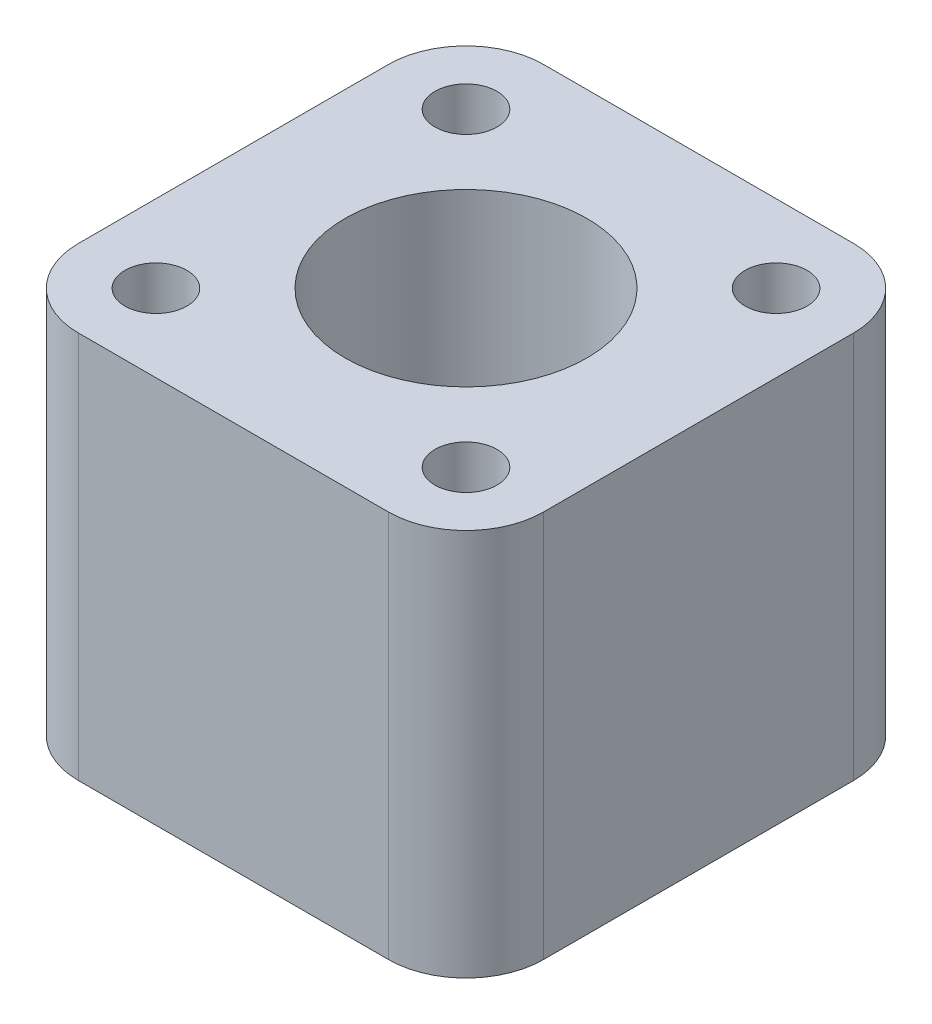
ISO-10303-21;
HEADER;
FILE_DESCRIPTION(('STEP AP214'),'2;1');
FILE_NAME('part.step','',(''),(''),'','','');
FILE_SCHEMA(('AUTOMOTIVE_DESIGN { 1 0 10303 214 1 1 1 1 }'));
ENDSEC;
DATA;
#1=APPLICATION_CONTEXT('core data for automotive mechanical design processes');
#2=APPLICATION_PROTOCOL_DEFINITION('international standard','automotive_design',2000,#1);
#3=PRODUCT_CONTEXT('',#1,'mechanical');
#4=PRODUCT('Part','Part','',(#3));
#5=PRODUCT_RELATED_PRODUCT_CATEGORY('part','',(#4));
#6=PRODUCT_DEFINITION_FORMATION('','',#4);
#7=PRODUCT_DEFINITION_CONTEXT('part definition',#1,'design');
#8=PRODUCT_DEFINITION('design','',#6,#7);
#9=PRODUCT_DEFINITION_SHAPE('','',#8);
#10=(LENGTH_UNIT() NAMED_UNIT(*) SI_UNIT(.MILLI.,.METRE.));
#11=(NAMED_UNIT(*) PLANE_ANGLE_UNIT() SI_UNIT($,.RADIAN.));
#12=(NAMED_UNIT(*) SI_UNIT($,.STERADIAN.) SOLID_ANGLE_UNIT());
#13=UNCERTAINTY_MEASURE_WITH_UNIT(LENGTH_MEASURE(1.E-05),#10,'distance_accuracy_value','');
#14=(GEOMETRIC_REPRESENTATION_CONTEXT(3) GLOBAL_UNCERTAINTY_ASSIGNED_CONTEXT((#13)) GLOBAL_UNIT_ASSIGNED_CONTEXT((#10,
#11,#12)) REPRESENTATION_CONTEXT('',''));
#15=CARTESIAN_POINT('',(0.,0.,0.));
#16=DIRECTION('',(0.,0.,1.));
#17=DIRECTION('',(1.,0.,0.));
#18=AXIS2_PLACEMENT_3D('',#15,#16,#17);
#19=CARTESIAN_POINT('',(0.,15.875,0.));
#20=DIRECTION('',(0.,-1.,0.));
#21=DIRECTION('',(0.,0.,-1.));
#22=AXIS2_PLACEMENT_3D('',#19,#20,#21);
#23=CYLINDRICAL_SURFACE('',#22,3.96875);
#24=CARTESIAN_POINT('',(0.,0.,0.));
#25=DIRECTION('',(0.,1.,0.));
#26=DIRECTION('',(0.,0.,1.));
#27=AXIS2_PLACEMENT_3D('',#24,#25,#26);
#28=CIRCLE('',#27,3.96875);
#29=CARTESIAN_POINT('',(0.,0.,3.96875));
#30=VERTEX_POINT('',#29);
#31=EDGE_CURVE('E205',#30,#30,#28,.T.);
#32=ORIENTED_EDGE('',*,*,#31,.F.);
#33=EDGE_LOOP('',(#32));
#34=FACE_BOUND('',#33,.T.);
#35=CARTESIAN_POINT('',(0.,6.35,0.));
#36=DIRECTION('',(0.,1.,0.));
#37=DIRECTION('',(0.,0.,1.));
#38=AXIS2_PLACEMENT_3D('',#35,#36,#37);
#39=CIRCLE('',#38,3.96875);
#40=CARTESIAN_POINT('',(0.,6.35,3.96875));
#41=VERTEX_POINT('',#40);
#42=EDGE_CURVE('E37',#41,#41,#39,.T.);
#43=ORIENTED_EDGE('',*,*,#42,.T.);
#44=EDGE_LOOP('',(#43));
#45=FACE_BOUND('',#44,.T.);
#46=ADVANCED_FACE('F33',(#34,#45),#23,.F.);
#47=CARTESIAN_POINT('',(0.,15.875,0.));
#48=DIRECTION('',(0.,-1.,0.));
#49=DIRECTION('',(0.,0.,-1.));
#50=AXIS2_PLACEMENT_3D('',#47,#48,#49);
#51=PLANE('',#50);
#52=CARTESIAN_POINT('',(0.,15.875,0.));
#53=DIRECTION('',(0.,1.,0.));
#54=DIRECTION('',(0.,0.,1.));
#55=AXIS2_PLACEMENT_3D('',#52,#53,#54);
#56=CIRCLE('',#55,4.953);
#57=CARTESIAN_POINT('',(0.,15.875,4.953));
#58=VERTEX_POINT('',#57);
#59=EDGE_CURVE('E261',#58,#58,#56,.T.);
#60=ORIENTED_EDGE('',*,*,#59,.F.);
#61=EDGE_LOOP('',(#60));
#62=FACE_BOUND('',#61,.T.);
#63=DIRECTION('',(0.,0.,-1.));
#64=VECTOR('',#63,1.);
#65=CARTESIAN_POINT('',(9.525,15.875,9.525));
#66=LINE('',#65,#64);
#67=CARTESIAN_POINT('',(9.525,15.875,6.35));
#68=VERTEX_POINT('',#67);
#69=CARTESIAN_POINT('',(9.525,15.875,-6.35));
#70=VERTEX_POINT('',#69);
#71=EDGE_CURVE('E137',#68,#70,#66,.T.);
#72=ORIENTED_EDGE('',*,*,#71,.T.);
#73=CARTESIAN_POINT('',(6.35,15.875,-6.35));
#74=DIRECTION('',(0.,-1.,0.));
#75=DIRECTION('',(0.,0.,-1.));
#76=AXIS2_PLACEMENT_3D('',#73,#74,#75);
#77=CIRCLE('',#76,3.175);
#78=CARTESIAN_POINT('',(6.34999999999999,15.875,-9.525));
#79=VERTEX_POINT('',#78);
#80=EDGE_CURVE('E152',#70,#79,#77,.F.);
#81=ORIENTED_EDGE('',*,*,#80,.T.);
#82=DIRECTION('',(-1.,0.,0.));
#83=VECTOR('',#82,1.);
#84=CARTESIAN_POINT('',(-9.525,15.875,-9.525));
#85=LINE('',#84,#83);
#86=CARTESIAN_POINT('',(-6.35,15.875,-9.525));
#87=VERTEX_POINT('',#86);
#88=EDGE_CURVE('E119',#79,#87,#85,.T.);
#89=ORIENTED_EDGE('',*,*,#88,.T.);
#90=CARTESIAN_POINT('',(-6.35,15.875,-6.35));
#91=DIRECTION('',(0.,-1.,0.));
#92=DIRECTION('',(0.,0.,-1.));
#93=AXIS2_PLACEMENT_3D('',#90,#91,#92);
#94=CIRCLE('',#93,3.175);
#95=CARTESIAN_POINT('',(-9.525,15.875,-6.34999999999999));
#96=VERTEX_POINT('',#95);
#97=EDGE_CURVE('E150',#87,#96,#94,.F.);
#98=ORIENTED_EDGE('',*,*,#97,.T.);
#99=DIRECTION('',(0.,0.,1.));
#100=VECTOR('',#99,1.);
#101=CARTESIAN_POINT('',(-9.525,15.875,9.525));
#102=LINE('',#101,#100);
#103=CARTESIAN_POINT('',(-9.525,15.875,6.35));
#104=VERTEX_POINT('',#103);
#105=EDGE_CURVE('E173',#96,#104,#102,.T.);
#106=ORIENTED_EDGE('',*,*,#105,.T.);
#107=CARTESIAN_POINT('',(-6.35,15.875,6.35));
#108=DIRECTION('',(0.,-1.,0.));
#109=DIRECTION('',(0.,0.,-1.));
#110=AXIS2_PLACEMENT_3D('',#107,#108,#109);
#111=CIRCLE('',#110,3.175);
#112=CARTESIAN_POINT('',(-6.35,15.875,9.525));
#113=VERTEX_POINT('',#112);
#114=EDGE_CURVE('E54',#104,#113,#111,.F.);
#115=ORIENTED_EDGE('',*,*,#114,.T.);
#116=DIRECTION('',(1.,0.,0.));
#117=VECTOR('',#116,1.);
#118=CARTESIAN_POINT('',(-9.525,15.875,9.525));
#119=LINE('',#118,#117);
#120=CARTESIAN_POINT('',(6.34999999999999,15.875,9.525));
#121=VERTEX_POINT('',#120);
#122=EDGE_CURVE('E138',#113,#121,#119,.T.);
#123=ORIENTED_EDGE('',*,*,#122,.T.);
#124=CARTESIAN_POINT('',(6.35,15.875,6.35));
#125=DIRECTION('',(0.,-1.,0.));
#126=DIRECTION('',(0.,0.,-1.));
#127=AXIS2_PLACEMENT_3D('',#124,#125,#126);
#128=CIRCLE('',#127,3.175);
#129=EDGE_CURVE('E148',#121,#68,#128,.F.);
#130=ORIENTED_EDGE('',*,*,#129,.T.);
#131=EDGE_LOOP('',(#72,#81,#89,#98,#106,#115,#123,#130));
#132=FACE_BOUND('',#131,.T.);
#133=CARTESIAN_POINT('',(-6.35,15.875,-6.35));
#134=DIRECTION('',(0.,1.,0.));
#135=DIRECTION('',(0.,0.,1.));
#136=AXIS2_PLACEMENT_3D('',#133,#134,#135);
#137=CIRCLE('',#136,1.27);
#138=CARTESIAN_POINT('',(-6.35,15.875,-5.08));
#139=VERTEX_POINT('',#138);
#140=EDGE_CURVE('E132',#139,#139,#137,.T.);
#141=ORIENTED_EDGE('',*,*,#140,.F.);
#142=EDGE_LOOP('',(#141));
#143=FACE_BOUND('',#142,.T.);
#144=CARTESIAN_POINT('',(6.35,15.875,-6.35));
#145=DIRECTION('',(0.,1.,0.));
#146=DIRECTION('',(0.,0.,1.));
#147=AXIS2_PLACEMENT_3D('',#144,#145,#146);
#148=CIRCLE('',#147,1.27);
#149=CARTESIAN_POINT('',(6.35,15.875,-5.08));
#150=VERTEX_POINT('',#149);
#151=EDGE_CURVE('E190',#150,#150,#148,.T.);
#152=ORIENTED_EDGE('',*,*,#151,.F.);
#153=EDGE_LOOP('',(#152));
#154=FACE_BOUND('',#153,.T.);
#155=CARTESIAN_POINT('',(6.35,15.875,6.35));
#156=DIRECTION('',(0.,1.,0.));
#157=DIRECTION('',(0.,0.,1.));
#158=AXIS2_PLACEMENT_3D('',#155,#156,#157);
#159=CIRCLE('',#158,1.27);
#160=CARTESIAN_POINT('',(6.35,15.875,7.62));
#161=VERTEX_POINT('',#160);
#162=EDGE_CURVE('E194',#161,#161,#159,.T.);
#163=ORIENTED_EDGE('',*,*,#162,.F.);
#164=EDGE_LOOP('',(#163));
#165=FACE_BOUND('',#164,.T.);
#166=CARTESIAN_POINT('',(-6.35,15.875,6.35));
#167=DIRECTION('',(0.,1.,0.));
#168=DIRECTION('',(0.,0.,1.));
#169=AXIS2_PLACEMENT_3D('',#166,#167,#168);
#170=CIRCLE('',#169,1.27);
#171=CARTESIAN_POINT('',(-6.35,15.875,7.62));
#172=VERTEX_POINT('',#171);
#173=EDGE_CURVE('E197',#172,#172,#170,.T.);
#174=ORIENTED_EDGE('',*,*,#173,.F.);
#175=EDGE_LOOP('',(#174));
#176=FACE_BOUND('',#175,.T.);
#177=ADVANCED_FACE('F179',(#62,#132,#143,#154,#165,#176),#51,.F.);
#178=CARTESIAN_POINT('',(0.,0.,0.));
#179=DIRECTION('',(0.,-1.,0.));
#180=DIRECTION('',(0.,0.,-1.));
#181=AXIS2_PLACEMENT_3D('',#178,#179,#180);
#182=PLANE('',#181);
#183=CARTESIAN_POINT('',(-6.35,0.,6.35));
#184=DIRECTION('',(0.,1.,0.));
#185=DIRECTION('',(0.,0.,1.));
#186=AXIS2_PLACEMENT_3D('',#183,#184,#185);
#187=CIRCLE('',#186,1.27);
#188=CARTESIAN_POINT('',(-6.35,0.,7.62));
#189=VERTEX_POINT('',#188);
#190=EDGE_CURVE('E200',#189,#189,#187,.T.);
#191=ORIENTED_EDGE('',*,*,#190,.T.);
#192=EDGE_LOOP('',(#191));
#193=FACE_BOUND('',#192,.T.);
#194=CARTESIAN_POINT('',(6.35,0.,-6.35));
#195=DIRECTION('',(0.,1.,0.));
#196=DIRECTION('',(0.,0.,1.));
#197=AXIS2_PLACEMENT_3D('',#194,#195,#196);
#198=CIRCLE('',#197,1.27);
#199=CARTESIAN_POINT('',(6.35,0.,-5.08));
#200=VERTEX_POINT('',#199);
#201=EDGE_CURVE('E210',#200,#200,#198,.T.);
#202=ORIENTED_EDGE('',*,*,#201,.T.);
#203=EDGE_LOOP('',(#202));
#204=FACE_BOUND('',#203,.T.);
#205=DIRECTION('',(-1.,0.,0.));
#206=VECTOR('',#205,1.);
#207=CARTESIAN_POINT('',(-9.525,0.,-9.525));
#208=LINE('',#207,#206);
#209=CARTESIAN_POINT('',(6.34999999999999,0.,-9.525));
#210=VERTEX_POINT('',#209);
#211=CARTESIAN_POINT('',(-6.35,0.,-9.525));
#212=VERTEX_POINT('',#211);
#213=EDGE_CURVE('E116',#210,#212,#208,.T.);
#214=ORIENTED_EDGE('',*,*,#213,.F.);
#215=CARTESIAN_POINT('',(6.35,0.,-6.35));
#216=DIRECTION('',(0.,-1.,0.));
#217=DIRECTION('',(0.,0.,-1.));
#218=AXIS2_PLACEMENT_3D('',#215,#216,#217);
#219=CIRCLE('',#218,3.175);
#220=CARTESIAN_POINT('',(9.525,0.,-6.35));
#221=VERTEX_POINT('',#220);
#222=EDGE_CURVE('E99',#210,#221,#219,.T.);
#223=ORIENTED_EDGE('',*,*,#222,.T.);
#224=DIRECTION('',(0.,0.,-1.));
#225=VECTOR('',#224,1.);
#226=CARTESIAN_POINT('',(9.525,0.,9.525));
#227=LINE('',#226,#225);
#228=CARTESIAN_POINT('',(9.525,0.,6.35));
#229=VERTEX_POINT('',#228);
#230=EDGE_CURVE('E127',#229,#221,#227,.T.);
#231=ORIENTED_EDGE('',*,*,#230,.F.);
#232=CARTESIAN_POINT('',(6.35,0.,6.35));
#233=DIRECTION('',(0.,-1.,0.));
#234=DIRECTION('',(0.,0.,-1.));
#235=AXIS2_PLACEMENT_3D('',#232,#233,#234);
#236=CIRCLE('',#235,3.175);
#237=CARTESIAN_POINT('',(6.34999999999999,0.,9.525));
#238=VERTEX_POINT('',#237);
#239=EDGE_CURVE('E141',#229,#238,#236,.T.);
#240=ORIENTED_EDGE('',*,*,#239,.T.);
#241=DIRECTION('',(1.,0.,0.));
#242=VECTOR('',#241,1.);
#243=CARTESIAN_POINT('',(-9.525,0.,9.525));
#244=LINE('',#243,#242);
#245=CARTESIAN_POINT('',(-6.35,0.,9.525));
#246=VERTEX_POINT('',#245);
#247=EDGE_CURVE('E130',#246,#238,#244,.T.);
#248=ORIENTED_EDGE('',*,*,#247,.F.);
#249=CARTESIAN_POINT('',(-6.35,0.,6.35));
#250=DIRECTION('',(0.,-1.,0.));
#251=DIRECTION('',(0.,0.,-1.));
#252=AXIS2_PLACEMENT_3D('',#249,#250,#251);
#253=CIRCLE('',#252,3.175);
#254=CARTESIAN_POINT('',(-9.525,0.,6.35));
#255=VERTEX_POINT('',#254);
#256=EDGE_CURVE('E120',#246,#255,#253,.T.);
#257=ORIENTED_EDGE('',*,*,#256,.T.);
#258=DIRECTION('',(0.,0.,1.));
#259=VECTOR('',#258,1.);
#260=CARTESIAN_POINT('',(-9.525,0.,9.525));
#261=LINE('',#260,#259);
#262=CARTESIAN_POINT('',(-9.525,0.,-6.34999999999999));
#263=VERTEX_POINT('',#262);
#264=EDGE_CURVE('E126',#263,#255,#261,.T.);
#265=ORIENTED_EDGE('',*,*,#264,.F.);
#266=CARTESIAN_POINT('',(-6.35,0.,-6.35));
#267=DIRECTION('',(0.,-1.,0.));
#268=DIRECTION('',(0.,0.,-1.));
#269=AXIS2_PLACEMENT_3D('',#266,#267,#268);
#270=CIRCLE('',#269,3.175);
#271=EDGE_CURVE('E110',#263,#212,#270,.T.);
#272=ORIENTED_EDGE('',*,*,#271,.T.);
#273=EDGE_LOOP('',(#214,#223,#231,#240,#248,#257,#265,#272));
#274=FACE_BOUND('',#273,.T.);
#275=CARTESIAN_POINT('',(-6.35,0.,-6.35));
#276=DIRECTION('',(0.,1.,0.));
#277=DIRECTION('',(0.,0.,1.));
#278=AXIS2_PLACEMENT_3D('',#275,#276,#277);
#279=CIRCLE('',#278,1.27);
#280=CARTESIAN_POINT('',(-6.35,0.,-5.08));
#281=VERTEX_POINT('',#280);
#282=EDGE_CURVE('E176',#281,#281,#279,.T.);
#283=ORIENTED_EDGE('',*,*,#282,.T.);
#284=EDGE_LOOP('',(#283));
#285=FACE_BOUND('',#284,.T.);
#286=CARTESIAN_POINT('',(6.35,0.,6.35));
#287=DIRECTION('',(0.,1.,0.));
#288=DIRECTION('',(0.,0.,1.));
#289=AXIS2_PLACEMENT_3D('',#286,#287,#288);
#290=CIRCLE('',#289,1.27);
#291=CARTESIAN_POINT('',(6.35,0.,7.62));
#292=VERTEX_POINT('',#291);
#293=EDGE_CURVE('E199',#292,#292,#290,.T.);
#294=ORIENTED_EDGE('',*,*,#293,.T.);
#295=EDGE_LOOP('',(#294));
#296=FACE_BOUND('',#295,.T.);
#297=ORIENTED_EDGE('',*,*,#31,.T.);
#298=EDGE_LOOP('',(#297));
#299=FACE_BOUND('',#298,.T.);
#300=ADVANCED_FACE('F123',(#193,#204,#274,#285,#296,#299),#182,.T.);
#301=CARTESIAN_POINT('',(9.525,15.875,9.525));
#302=DIRECTION('',(-1.,0.,0.));
#303=DIRECTION('',(0.,0.,1.));
#304=AXIS2_PLACEMENT_3D('',#301,#302,#303);
#305=PLANE('',#304);
#306=ORIENTED_EDGE('',*,*,#230,.T.);
#307=DIRECTION('',(0.,-1.,0.));
#308=VECTOR('',#307,1.);
#309=CARTESIAN_POINT('',(9.525,15.875,-6.35));
#310=LINE('',#309,#308);
#311=EDGE_CURVE('E104',#221,#70,#310,.F.);
#312=ORIENTED_EDGE('',*,*,#311,.T.);
#313=ORIENTED_EDGE('',*,*,#71,.F.);
#314=DIRECTION('',(0.,-1.,0.));
#315=VECTOR('',#314,1.);
#316=CARTESIAN_POINT('',(9.525,15.875,6.35));
#317=LINE('',#316,#315);
#318=EDGE_CURVE('E109',#68,#229,#317,.T.);
#319=ORIENTED_EDGE('',*,*,#318,.T.);
#320=EDGE_LOOP('',(#306,#312,#313,#319));
#321=FACE_BOUND('',#320,.T.);
#322=ADVANCED_FACE('F170',(#321),#305,.F.);
#323=CARTESIAN_POINT('',(-9.525,15.875,-9.525));
#324=DIRECTION('',(0.,0.,1.));
#325=DIRECTION('',(1.,0.,0.));
#326=AXIS2_PLACEMENT_3D('',#323,#324,#325);
#327=PLANE('',#326);
#328=ORIENTED_EDGE('',*,*,#88,.F.);
#329=DIRECTION('',(0.,-1.,0.));
#330=VECTOR('',#329,1.);
#331=CARTESIAN_POINT('',(6.35,15.875,-9.525));
#332=LINE('',#331,#330);
#333=EDGE_CURVE('E103',#79,#210,#332,.T.);
#334=ORIENTED_EDGE('',*,*,#333,.T.);
#335=ORIENTED_EDGE('',*,*,#213,.T.);
#336=DIRECTION('',(0.,-1.,0.));
#337=VECTOR('',#336,1.);
#338=CARTESIAN_POINT('',(-6.35,15.875,-9.525));
#339=LINE('',#338,#337);
#340=EDGE_CURVE('E121',#212,#87,#339,.F.);
#341=ORIENTED_EDGE('',*,*,#340,.T.);
#342=EDGE_LOOP('',(#328,#334,#335,#341));
#343=FACE_BOUND('',#342,.T.);
#344=ADVANCED_FACE('F115',(#343),#327,.F.);
#345=CARTESIAN_POINT('',(-9.525,15.875,9.525));
#346=DIRECTION('',(1.,0.,0.));
#347=DIRECTION('',(0.,0.,-1.));
#348=AXIS2_PLACEMENT_3D('',#345,#346,#347);
#349=PLANE('',#348);
#350=ORIENTED_EDGE('',*,*,#105,.F.);
#351=DIRECTION('',(0.,-1.,0.));
#352=VECTOR('',#351,1.);
#353=CARTESIAN_POINT('',(-9.525,15.875,-6.35));
#354=LINE('',#353,#352);
#355=EDGE_CURVE('E156',#96,#263,#354,.T.);
#356=ORIENTED_EDGE('',*,*,#355,.T.);
#357=ORIENTED_EDGE('',*,*,#264,.T.);
#358=DIRECTION('',(0.,-1.,0.));
#359=VECTOR('',#358,1.);
#360=CARTESIAN_POINT('',(-9.525,15.875,6.35));
#361=LINE('',#360,#359);
#362=EDGE_CURVE('E154',#255,#104,#361,.F.);
#363=ORIENTED_EDGE('',*,*,#362,.T.);
#364=EDGE_LOOP('',(#350,#356,#357,#363));
#365=FACE_BOUND('',#364,.T.);
#366=ADVANCED_FACE('F230',(#365),#349,.F.);
#367=CARTESIAN_POINT('',(-9.525,15.875,9.525));
#368=DIRECTION('',(0.,0.,-1.));
#369=DIRECTION('',(-1.,0.,0.));
#370=AXIS2_PLACEMENT_3D('',#367,#368,#369);
#371=PLANE('',#370);
#372=ORIENTED_EDGE('',*,*,#247,.T.);
#373=DIRECTION('',(0.,-1.,0.));
#374=VECTOR('',#373,1.);
#375=CARTESIAN_POINT('',(6.35,15.875,9.525));
#376=LINE('',#375,#374);
#377=EDGE_CURVE('E11',#238,#121,#376,.F.);
#378=ORIENTED_EDGE('',*,*,#377,.T.);
#379=ORIENTED_EDGE('',*,*,#122,.F.);
#380=DIRECTION('',(0.,-1.,0.));
#381=VECTOR('',#380,1.);
#382=CARTESIAN_POINT('',(-6.35,15.875,9.525));
#383=LINE('',#382,#381);
#384=EDGE_CURVE('E42',#113,#246,#383,.T.);
#385=ORIENTED_EDGE('',*,*,#384,.T.);
#386=EDGE_LOOP('',(#372,#378,#379,#385));
#387=FACE_BOUND('',#386,.T.);
#388=ADVANCED_FACE('F162',(#387),#371,.F.);
#389=CARTESIAN_POINT('',(-6.35,15.875,-6.35));
#390=DIRECTION('',(0.,-1.,0.));
#391=DIRECTION('',(0.,0.,-1.));
#392=AXIS2_PLACEMENT_3D('',#389,#390,#391);
#393=CYLINDRICAL_SURFACE('',#392,1.27);
#394=ORIENTED_EDGE('',*,*,#140,.T.);
#395=EDGE_LOOP('',(#394));
#396=FACE_BOUND('',#395,.T.);
#397=ORIENTED_EDGE('',*,*,#282,.F.);
#398=EDGE_LOOP('',(#397));
#399=FACE_BOUND('',#398,.T.);
#400=ADVANCED_FACE('F219',(#396,#399),#393,.F.);
#401=CARTESIAN_POINT('',(6.35,15.875,-6.35));
#402=DIRECTION('',(0.,-1.,0.));
#403=DIRECTION('',(0.,0.,-1.));
#404=AXIS2_PLACEMENT_3D('',#401,#402,#403);
#405=CYLINDRICAL_SURFACE('',#404,1.27);
#406=ORIENTED_EDGE('',*,*,#151,.T.);
#407=EDGE_LOOP('',(#406));
#408=FACE_BOUND('',#407,.T.);
#409=ORIENTED_EDGE('',*,*,#201,.F.);
#410=EDGE_LOOP('',(#409));
#411=FACE_BOUND('',#410,.T.);
#412=ADVANCED_FACE('F221',(#408,#411),#405,.F.);
#413=CARTESIAN_POINT('',(6.35,15.875,6.35));
#414=DIRECTION('',(0.,-1.,0.));
#415=DIRECTION('',(0.,0.,-1.));
#416=AXIS2_PLACEMENT_3D('',#413,#414,#415);
#417=CYLINDRICAL_SURFACE('',#416,1.27);
#418=ORIENTED_EDGE('',*,*,#162,.T.);
#419=EDGE_LOOP('',(#418));
#420=FACE_BOUND('',#419,.T.);
#421=ORIENTED_EDGE('',*,*,#293,.F.);
#422=EDGE_LOOP('',(#421));
#423=FACE_BOUND('',#422,.T.);
#424=ADVANCED_FACE('F227',(#420,#423),#417,.F.);
#425=CARTESIAN_POINT('',(-6.35,15.875,6.35));
#426=DIRECTION('',(0.,-1.,0.));
#427=DIRECTION('',(0.,0.,-1.));
#428=AXIS2_PLACEMENT_3D('',#425,#426,#427);
#429=CYLINDRICAL_SURFACE('',#428,1.27);
#430=ORIENTED_EDGE('',*,*,#173,.T.);
#431=EDGE_LOOP('',(#430));
#432=FACE_BOUND('',#431,.T.);
#433=ORIENTED_EDGE('',*,*,#190,.F.);
#434=EDGE_LOOP('',(#433));
#435=FACE_BOUND('',#434,.T.);
#436=ADVANCED_FACE('F243',(#432,#435),#429,.F.);
#437=CARTESIAN_POINT('',(6.35,15.875,-6.35));
#438=DIRECTION('',(0.,-1.,0.));
#439=DIRECTION('',(0.,0.,-1.));
#440=AXIS2_PLACEMENT_3D('',#437,#438,#439);
#441=CYLINDRICAL_SURFACE('',#440,3.175);
#442=ORIENTED_EDGE('',*,*,#80,.F.);
#443=ORIENTED_EDGE('',*,*,#311,.F.);
#444=ORIENTED_EDGE('',*,*,#222,.F.);
#445=ORIENTED_EDGE('',*,*,#333,.F.);
#446=EDGE_LOOP('',(#442,#443,#444,#445));
#447=FACE_BOUND('',#446,.T.);
#448=ADVANCED_FACE('F102',(#447),#441,.T.);
#449=CARTESIAN_POINT('',(-6.35,15.875,-6.35));
#450=DIRECTION('',(0.,-1.,0.));
#451=DIRECTION('',(0.,0.,-1.));
#452=AXIS2_PLACEMENT_3D('',#449,#450,#451);
#453=CYLINDRICAL_SURFACE('',#452,3.175);
#454=ORIENTED_EDGE('',*,*,#97,.F.);
#455=ORIENTED_EDGE('',*,*,#340,.F.);
#456=ORIENTED_EDGE('',*,*,#271,.F.);
#457=ORIENTED_EDGE('',*,*,#355,.F.);
#458=EDGE_LOOP('',(#454,#455,#456,#457));
#459=FACE_BOUND('',#458,.T.);
#460=ADVANCED_FACE('F279',(#459),#453,.T.);
#461=CARTESIAN_POINT('',(6.35,15.875,6.35));
#462=DIRECTION('',(0.,-1.,0.));
#463=DIRECTION('',(0.,0.,-1.));
#464=AXIS2_PLACEMENT_3D('',#461,#462,#463);
#465=CYLINDRICAL_SURFACE('',#464,3.175);
#466=ORIENTED_EDGE('',*,*,#129,.F.);
#467=ORIENTED_EDGE('',*,*,#377,.F.);
#468=ORIENTED_EDGE('',*,*,#239,.F.);
#469=ORIENTED_EDGE('',*,*,#318,.F.);
#470=EDGE_LOOP('',(#466,#467,#468,#469));
#471=FACE_BOUND('',#470,.T.);
#472=ADVANCED_FACE('F167',(#471),#465,.T.);
#473=CARTESIAN_POINT('',(-6.35,15.875,6.35));
#474=DIRECTION('',(0.,-1.,0.));
#475=DIRECTION('',(0.,0.,-1.));
#476=AXIS2_PLACEMENT_3D('',#473,#474,#475);
#477=CYLINDRICAL_SURFACE('',#476,3.175);
#478=ORIENTED_EDGE('',*,*,#114,.F.);
#479=ORIENTED_EDGE('',*,*,#362,.F.);
#480=ORIENTED_EDGE('',*,*,#256,.F.);
#481=ORIENTED_EDGE('',*,*,#384,.F.);
#482=EDGE_LOOP('',(#478,#479,#480,#481));
#483=FACE_BOUND('',#482,.T.);
#484=ADVANCED_FACE('F35',(#483),#477,.T.);
#485=CARTESIAN_POINT('',(0.,6.35,0.));
#486=DIRECTION('',(0.,1.,0.));
#487=DIRECTION('',(0.,0.,1.));
#488=AXIS2_PLACEMENT_3D('',#485,#486,#487);
#489=CYLINDRICAL_SURFACE('',#488,4.953);
#490=CARTESIAN_POINT('',(0.,6.35,0.));
#491=DIRECTION('',(0.,1.,0.));
#492=DIRECTION('',(0.,0.,1.));
#493=AXIS2_PLACEMENT_3D('',#490,#491,#492);
#494=CIRCLE('',#493,4.953);
#495=CARTESIAN_POINT('',(0.,6.35,4.953));
#496=VERTEX_POINT('',#495);
#497=EDGE_CURVE('E258',#496,#496,#494,.T.);
#498=CARTESIAN_POINT('',(0.,6.35,4.953));
#499=CARTESIAN_POINT('',(0.,6.44921875,4.953));
#500=CARTESIAN_POINT('',(0.,6.5484375,4.953));
#501=CARTESIAN_POINT('',(0.,6.746875,4.953));
#502=CARTESIAN_POINT('',(0.,6.84609375,4.953));
#503=CARTESIAN_POINT('',(0.,7.04453125,4.953));
#504=CARTESIAN_POINT('',(0.,7.14375,4.953));
#505=CARTESIAN_POINT('',(0.,7.3421875,4.953));
#506=CARTESIAN_POINT('',(0.,7.44140625,4.953));
#507=CARTESIAN_POINT('',(0.,7.63984375,4.953));
#508=CARTESIAN_POINT('',(0.,7.7390625,4.953));
#509=CARTESIAN_POINT('',(0.,7.9375,4.953));
#510=CARTESIAN_POINT('',(0.,8.03671875,4.953));
#511=CARTESIAN_POINT('',(0.,8.23515625,4.953));
#512=CARTESIAN_POINT('',(0.,8.334375,4.953));
#513=CARTESIAN_POINT('',(0.,8.5328125,4.953));
#514=CARTESIAN_POINT('',(0.,8.63203125,4.953));
#515=CARTESIAN_POINT('',(0.,8.83046875,4.953));
#516=CARTESIAN_POINT('',(0.,8.9296875,4.953));
#517=CARTESIAN_POINT('',(0.,9.128125,4.953));
#518=CARTESIAN_POINT('',(0.,9.22734375,4.953));
#519=CARTESIAN_POINT('',(0.,9.42578125,4.953));
#520=CARTESIAN_POINT('',(0.,9.525,4.953));
#521=CARTESIAN_POINT('',(0.,9.7234375,4.953));
#522=CARTESIAN_POINT('',(0.,9.82265625,4.953));
#523=CARTESIAN_POINT('',(0.,10.02109375,4.953));
#524=CARTESIAN_POINT('',(0.,10.1203125,4.953));
#525=CARTESIAN_POINT('',(0.,10.31875,4.953));
#526=CARTESIAN_POINT('',(0.,10.41796875,4.953));
#527=CARTESIAN_POINT('',(0.,10.61640625,4.953));
#528=CARTESIAN_POINT('',(0.,10.715625,4.953));
#529=CARTESIAN_POINT('',(0.,10.9140625,4.953));
#530=CARTESIAN_POINT('',(0.,11.01328125,4.953));
#531=CARTESIAN_POINT('',(0.,11.21171875,4.953));
#532=CARTESIAN_POINT('',(0.,11.3109375,4.953));
#533=CARTESIAN_POINT('',(0.,11.509375,4.953));
#534=CARTESIAN_POINT('',(0.,11.60859375,4.953));
#535=CARTESIAN_POINT('',(0.,11.80703125,4.953));
#536=CARTESIAN_POINT('',(0.,11.90625,4.953));
#537=CARTESIAN_POINT('',(0.,12.1046875,4.953));
#538=CARTESIAN_POINT('',(0.,12.20390625,4.953));
#539=CARTESIAN_POINT('',(0.,12.40234375,4.953));
#540=CARTESIAN_POINT('',(0.,12.5015625,4.953));
#541=CARTESIAN_POINT('',(0.,12.7,4.953));
#542=CARTESIAN_POINT('',(0.,12.79921875,4.953));
#543=CARTESIAN_POINT('',(0.,12.99765625,4.953));
#544=CARTESIAN_POINT('',(0.,13.096875,4.953));
#545=CARTESIAN_POINT('',(0.,13.2953125,4.953));
#546=CARTESIAN_POINT('',(0.,13.39453125,4.953));
#547=CARTESIAN_POINT('',(0.,13.59296875,4.953));
#548=CARTESIAN_POINT('',(0.,13.6921875,4.953));
#549=CARTESIAN_POINT('',(0.,13.890625,4.953));
#550=CARTESIAN_POINT('',(0.,13.98984375,4.953));
#551=CARTESIAN_POINT('',(0.,14.18828125,4.953));
#552=CARTESIAN_POINT('',(0.,14.2875,4.953));
#553=CARTESIAN_POINT('',(0.,14.4859375,4.953));
#554=CARTESIAN_POINT('',(0.,14.58515625,4.953));
#555=CARTESIAN_POINT('',(0.,14.78359375,4.953));
#556=CARTESIAN_POINT('',(0.,14.8828125,4.953));
#557=CARTESIAN_POINT('',(0.,15.08125,4.953));
#558=CARTESIAN_POINT('',(0.,15.18046875,4.953));
#559=CARTESIAN_POINT('',(0.,15.37890625,4.953));
#560=CARTESIAN_POINT('',(0.,15.478125,4.953));
#561=CARTESIAN_POINT('',(0.,15.6765625,4.953));
#562=CARTESIAN_POINT('',(0.,15.77578125,4.953));
#563=CARTESIAN_POINT('',(0.,15.875,4.953));
#564=B_SPLINE_CURVE_WITH_KNOTS('',3,(#498,#499,#500,#501,#502,#503,#504,#505,#506,#507,#508,
#509,#510,#511,#512,#513,#514,#515,#516,#517,#518,#519,#520,#521,#522,#523,#524,#525,#526,#527,
#528,#529,#530,#531,#532,#533,#534,#535,#536,#537,#538,#539,#540,#541,#542,#543,#544,#545,#546,
#547,#548,#549,#550,#551,#552,#553,#554,#555,#556,#557,#558,#559,#560,#561,#562,#563),
.UNSPECIFIED.,.F.,.F.,(4,2,2,2,2,2,2,2,2,2,2,2,2,2,2,2,2,2,2,2,2,2,2,2,2,2,2,2,2,2,2,2,4),(0.,
0.297656249999999,0.595312499999999,0.89296875,1.190625,1.48828125,1.7859375,2.08359375,2.38125,
2.67890625,2.9765625,3.27421875,3.571875,3.86953125,4.1671875,4.46484375,4.7625,5.06015625,
5.3578125,5.65546875,5.953125,6.25078125,6.5484375,6.84609375,7.14375,7.44140625,7.7390625,
8.03671875,8.334375,8.63203125,8.9296875,9.22734375,9.525),.UNSPECIFIED.);
#565=EDGE_CURVE('BSEAM241',#496,#58,#564,.T.);
#566=ORIENTED_EDGE('',*,*,#497,.F.);
#567=ORIENTED_EDGE('',*,*,#59,.T.);
#568=ORIENTED_EDGE('',*,*,#565,.T.);
#569=ORIENTED_EDGE('',*,*,#565,.F.);
#570=EDGE_LOOP('',(#566,#568,#567,#569));
#571=FACE_BOUND('',#570,.T.);
#572=ADVANCED_FACE('F241',(#571),#489,.F.);
#573=CARTESIAN_POINT('',(0.,6.35,0.));
#574=DIRECTION('',(0.,1.,0.));
#575=DIRECTION('',(0.,0.,1.));
#576=AXIS2_PLACEMENT_3D('',#573,#574,#575);
#577=PLANE('',#576);
#578=ORIENTED_EDGE('',*,*,#42,.F.);
#579=EDGE_LOOP('',(#578));
#580=FACE_BOUND('',#579,.T.);
#581=ORIENTED_EDGE('',*,*,#497,.T.);
#582=EDGE_LOOP('',(#581));
#583=FACE_BOUND('',#582,.T.);
#584=ADVANCED_FACE('F269',(#580,#583),#577,.T.);
#585=CLOSED_SHELL('',(#46,#177,#300,#322,#344,#366,#388,#400,#412,#424,#436,#448,#460,#472,#484,
#572,#584));
#586=MANIFOLD_SOLID_BREP('B2',#585);
#587=ADVANCED_BREP_SHAPE_REPRESENTATION('',(#18,#586),#14);
#588=SHAPE_DEFINITION_REPRESENTATION(#9,#587);
ENDSEC;
END-ISO-10303-21;
